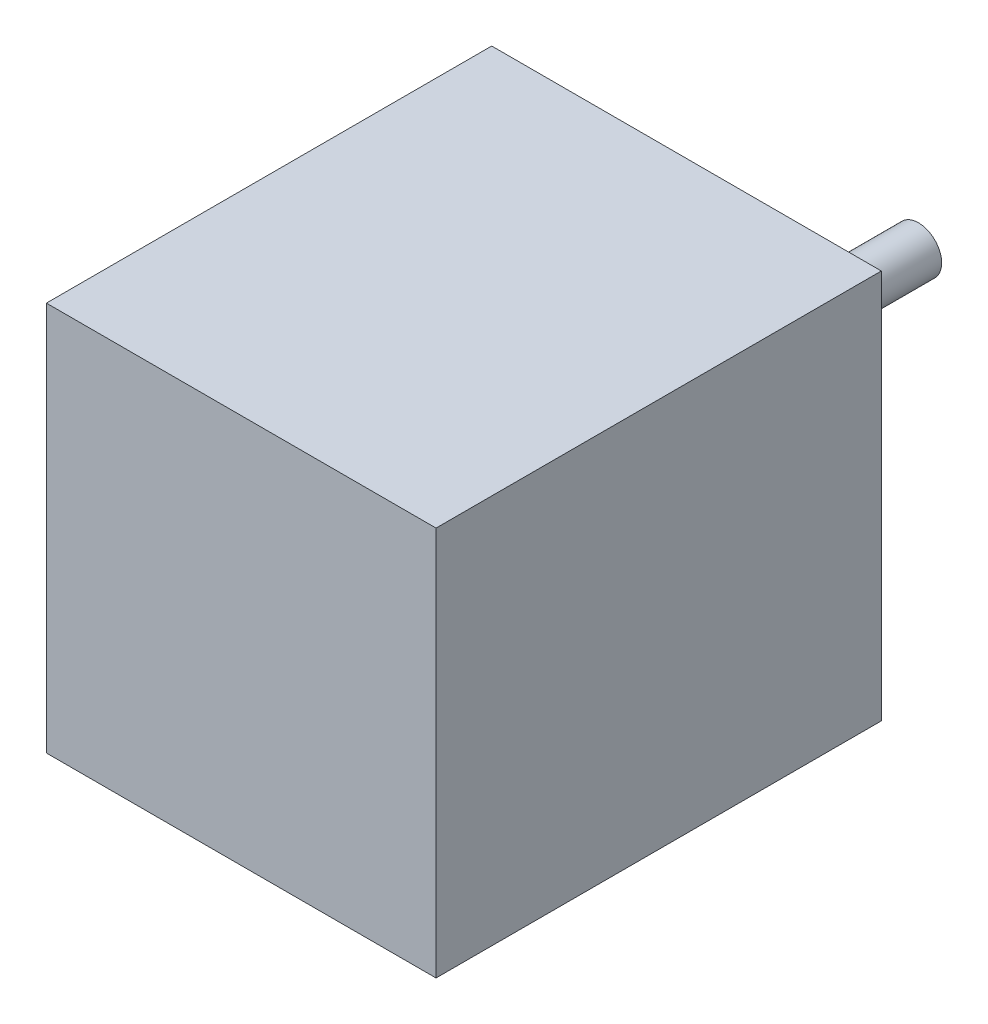
ISO-10303-21;
HEADER;
FILE_DESCRIPTION(('STEP AP214'),'2;1');
FILE_NAME('part.step','',(''),(''),'','','');
FILE_SCHEMA(('AUTOMOTIVE_DESIGN { 1 0 10303 214 1 1 1 1 }'));
ENDSEC;
DATA;
#1=APPLICATION_CONTEXT('core data for automotive mechanical design processes');
#2=APPLICATION_PROTOCOL_DEFINITION('international standard','automotive_design',2000,#1);
#3=PRODUCT_CONTEXT('',#1,'mechanical');
#4=PRODUCT('Part','Part','',(#3));
#5=PRODUCT_RELATED_PRODUCT_CATEGORY('part','',(#4));
#6=PRODUCT_DEFINITION_FORMATION('','',#4);
#7=PRODUCT_DEFINITION_CONTEXT('part definition',#1,'design');
#8=PRODUCT_DEFINITION('design','',#6,#7);
#9=PRODUCT_DEFINITION_SHAPE('','',#8);
#10=(LENGTH_UNIT() NAMED_UNIT(*) SI_UNIT(.MILLI.,.METRE.));
#11=(NAMED_UNIT(*) PLANE_ANGLE_UNIT() SI_UNIT($,.RADIAN.));
#12=(NAMED_UNIT(*) SI_UNIT($,.STERADIAN.) SOLID_ANGLE_UNIT());
#13=UNCERTAINTY_MEASURE_WITH_UNIT(LENGTH_MEASURE(1.E-05),#10,'distance_accuracy_value','');
#14=(GEOMETRIC_REPRESENTATION_CONTEXT(3) GLOBAL_UNCERTAINTY_ASSIGNED_CONTEXT((#13)) GLOBAL_UNIT_ASSIGNED_CONTEXT((#10,
#11,#12)) REPRESENTATION_CONTEXT('',''));
#15=CARTESIAN_POINT('',(0.,0.,0.));
#16=DIRECTION('',(0.,0.,1.));
#17=DIRECTION('',(1.,0.,0.));
#18=AXIS2_PLACEMENT_3D('',#15,#16,#17);
#19=CARTESIAN_POINT('',(0.,0.,48.));
#20=DIRECTION('',(-1.,0.,0.));
#21=DIRECTION('',(0.,0.,1.));
#22=AXIS2_PLACEMENT_3D('',#19,#20,#21);
#23=PLANE('',#22);
#24=DIRECTION('',(0.,1.,0.));
#25=VECTOR('',#24,1.);
#26=CARTESIAN_POINT('',(0.,0.,0.));
#27=LINE('',#26,#25);
#28=CARTESIAN_POINT('',(0.,0.,0.));
#29=VERTEX_POINT('',#28);
#30=CARTESIAN_POINT('',(0.,42.,0.));
#31=VERTEX_POINT('',#30);
#32=EDGE_CURVE('E113',#29,#31,#27,.T.);
#33=ORIENTED_EDGE('',*,*,#32,.T.);
#34=DIRECTION('',(0.,0.,-1.));
#35=VECTOR('',#34,1.);
#36=CARTESIAN_POINT('',(0.,42.,48.));
#37=LINE('',#36,#35);
#38=CARTESIAN_POINT('',(0.,42.,48.));
#39=VERTEX_POINT('',#38);
#40=EDGE_CURVE('E44',#39,#31,#37,.T.);
#41=ORIENTED_EDGE('',*,*,#40,.F.);
#42=DIRECTION('',(0.,1.,0.));
#43=VECTOR('',#42,1.);
#44=CARTESIAN_POINT('',(0.,0.,48.));
#45=LINE('',#44,#43);
#46=CARTESIAN_POINT('',(0.,0.,48.));
#47=VERTEX_POINT('',#46);
#48=EDGE_CURVE('E96',#47,#39,#45,.T.);
#49=ORIENTED_EDGE('',*,*,#48,.F.);
#50=DIRECTION('',(0.,0.,-1.));
#51=VECTOR('',#50,1.);
#52=CARTESIAN_POINT('',(0.,0.,48.));
#53=LINE('',#52,#51);
#54=EDGE_CURVE('E109',#47,#29,#53,.T.);
#55=ORIENTED_EDGE('',*,*,#54,.T.);
#56=EDGE_LOOP('',(#33,#41,#49,#55));
#57=FACE_BOUND('',#56,.T.);
#58=ADVANCED_FACE('F41',(#57),#23,.F.);
#59=CARTESIAN_POINT('',(0.,42.,48.));
#60=DIRECTION('',(0.,-1.,0.));
#61=DIRECTION('',(1.,0.,0.));
#62=AXIS2_PLACEMENT_3D('',#59,#60,#61);
#63=PLANE('',#62);
#64=DIRECTION('',(-1.,0.,0.));
#65=VECTOR('',#64,1.);
#66=CARTESIAN_POINT('',(0.,42.,0.));
#67=LINE('',#66,#65);
#68=CARTESIAN_POINT('',(-42.,42.,0.));
#69=VERTEX_POINT('',#68);
#70=EDGE_CURVE('E102',#31,#69,#67,.T.);
#71=ORIENTED_EDGE('',*,*,#70,.T.);
#72=DIRECTION('',(0.,0.,-1.));
#73=VECTOR('',#72,1.);
#74=CARTESIAN_POINT('',(-42.,42.,48.));
#75=LINE('',#74,#73);
#76=CARTESIAN_POINT('',(-42.,42.,48.));
#77=VERTEX_POINT('',#76);
#78=EDGE_CURVE('E100',#77,#69,#75,.T.);
#79=ORIENTED_EDGE('',*,*,#78,.F.);
#80=DIRECTION('',(-1.,0.,0.));
#81=VECTOR('',#80,1.);
#82=CARTESIAN_POINT('',(0.,42.,48.));
#83=LINE('',#82,#81);
#84=EDGE_CURVE('E91',#39,#77,#83,.T.);
#85=ORIENTED_EDGE('',*,*,#84,.F.);
#86=ORIENTED_EDGE('',*,*,#40,.T.);
#87=EDGE_LOOP('',(#71,#79,#85,#86));
#88=FACE_BOUND('',#87,.T.);
#89=ADVANCED_FACE('F101',(#88),#63,.F.);
#90=CARTESIAN_POINT('',(-42.,0.,48.));
#91=DIRECTION('',(1.,0.,0.));
#92=DIRECTION('',(0.,0.,-1.));
#93=AXIS2_PLACEMENT_3D('',#90,#91,#92);
#94=PLANE('',#93);
#95=DIRECTION('',(0.,-1.,0.));
#96=VECTOR('',#95,1.);
#97=CARTESIAN_POINT('',(-42.,0.,0.));
#98=LINE('',#97,#96);
#99=CARTESIAN_POINT('',(-42.,0.,0.));
#100=VERTEX_POINT('',#99);
#101=EDGE_CURVE('E77',#69,#100,#98,.T.);
#102=ORIENTED_EDGE('',*,*,#101,.T.);
#103=DIRECTION('',(0.,0.,-1.));
#104=VECTOR('',#103,1.);
#105=CARTESIAN_POINT('',(-42.,0.,48.));
#106=LINE('',#105,#104);
#107=CARTESIAN_POINT('',(-42.,0.,48.));
#108=VERTEX_POINT('',#107);
#109=EDGE_CURVE('E104',#108,#100,#106,.T.);
#110=ORIENTED_EDGE('',*,*,#109,.F.);
#111=DIRECTION('',(0.,-1.,0.));
#112=VECTOR('',#111,1.);
#113=CARTESIAN_POINT('',(-42.,0.,48.));
#114=LINE('',#113,#112);
#115=EDGE_CURVE('E94',#77,#108,#114,.T.);
#116=ORIENTED_EDGE('',*,*,#115,.F.);
#117=ORIENTED_EDGE('',*,*,#78,.T.);
#118=EDGE_LOOP('',(#102,#110,#116,#117));
#119=FACE_BOUND('',#118,.T.);
#120=ADVANCED_FACE('F105',(#119),#94,.F.);
#121=CARTESIAN_POINT('',(0.,0.,48.));
#122=DIRECTION('',(0.,1.,0.));
#123=DIRECTION('',(-1.,0.,0.));
#124=AXIS2_PLACEMENT_3D('',#121,#122,#123);
#125=PLANE('',#124);
#126=DIRECTION('',(1.,0.,0.));
#127=VECTOR('',#126,1.);
#128=CARTESIAN_POINT('',(0.,0.,0.));
#129=LINE('',#128,#127);
#130=EDGE_CURVE('E83',#100,#29,#129,.T.);
#131=ORIENTED_EDGE('',*,*,#130,.T.);
#132=ORIENTED_EDGE('',*,*,#54,.F.);
#133=DIRECTION('',(1.,0.,0.));
#134=VECTOR('',#133,1.);
#135=CARTESIAN_POINT('',(0.,0.,48.));
#136=LINE('',#135,#134);
#137=EDGE_CURVE('E60',#108,#47,#136,.T.);
#138=ORIENTED_EDGE('',*,*,#137,.F.);
#139=ORIENTED_EDGE('',*,*,#109,.T.);
#140=EDGE_LOOP('',(#131,#132,#138,#139));
#141=FACE_BOUND('',#140,.T.);
#142=ADVANCED_FACE('F127',(#141),#125,.F.);
#143=CARTESIAN_POINT('',(0.,0.,48.));
#144=DIRECTION('',(0.,0.,1.));
#145=DIRECTION('',(1.,0.,0.));
#146=AXIS2_PLACEMENT_3D('',#143,#144,#145);
#147=PLANE('',#146);
#148=ORIENTED_EDGE('',*,*,#48,.T.);
#149=ORIENTED_EDGE('',*,*,#84,.T.);
#150=ORIENTED_EDGE('',*,*,#115,.T.);
#151=ORIENTED_EDGE('',*,*,#137,.T.);
#152=EDGE_LOOP('',(#148,#149,#150,#151));
#153=FACE_BOUND('',#152,.T.);
#154=ADVANCED_FACE('F92',(#153),#147,.T.);
#155=CARTESIAN_POINT('',(0.,0.,0.));
#156=DIRECTION('',(0.,0.,1.));
#157=DIRECTION('',(1.,0.,0.));
#158=AXIS2_PLACEMENT_3D('',#155,#156,#157);
#159=PLANE('',#158);
#160=CARTESIAN_POINT('',(-5.5,36.5,0.));
#161=DIRECTION('',(0.,0.,-1.));
#162=DIRECTION('',(-1.,0.,0.));
#163=AXIS2_PLACEMENT_3D('',#160,#161,#162);
#164=CIRCLE('',#163,1.5);
#165=CARTESIAN_POINT('',(-7.,36.5,0.));
#166=VERTEX_POINT('',#165);
#167=EDGE_CURVE('E153',#166,#166,#164,.T.);
#168=ORIENTED_EDGE('',*,*,#167,.F.);
#169=EDGE_LOOP('',(#168));
#170=FACE_BOUND('',#169,.T.);
#171=CARTESIAN_POINT('',(-36.5,36.5,0.));
#172=DIRECTION('',(0.,0.,-1.));
#173=DIRECTION('',(-1.,0.,0.));
#174=AXIS2_PLACEMENT_3D('',#171,#172,#173);
#175=CIRCLE('',#174,1.5);
#176=CARTESIAN_POINT('',(-38.,36.5,0.));
#177=VERTEX_POINT('',#176);
#178=EDGE_CURVE('E161',#177,#177,#175,.T.);
#179=ORIENTED_EDGE('',*,*,#178,.F.);
#180=EDGE_LOOP('',(#179));
#181=FACE_BOUND('',#180,.T.);
#182=CARTESIAN_POINT('',(-36.5,5.5,0.));
#183=DIRECTION('',(0.,0.,-1.));
#184=DIRECTION('',(-1.,0.,0.));
#185=AXIS2_PLACEMENT_3D('',#182,#183,#184);
#186=CIRCLE('',#185,1.5);
#187=CARTESIAN_POINT('',(-38.,5.5,0.));
#188=VERTEX_POINT('',#187);
#189=EDGE_CURVE('E169',#188,#188,#186,.T.);
#190=ORIENTED_EDGE('',*,*,#189,.F.);
#191=EDGE_LOOP('',(#190));
#192=FACE_BOUND('',#191,.T.);
#193=CARTESIAN_POINT('',(-5.5,5.5,0.));
#194=DIRECTION('',(0.,0.,-1.));
#195=DIRECTION('',(-1.,0.,0.));
#196=AXIS2_PLACEMENT_3D('',#193,#194,#195);
#197=CIRCLE('',#196,1.5);
#198=CARTESIAN_POINT('',(-7.,5.5,0.));
#199=VERTEX_POINT('',#198);
#200=EDGE_CURVE('E145',#199,#199,#197,.T.);
#201=ORIENTED_EDGE('',*,*,#200,.F.);
#202=EDGE_LOOP('',(#201));
#203=FACE_BOUND('',#202,.T.);
#204=CARTESIAN_POINT('',(-21.,21.,0.));
#205=DIRECTION('',(0.,0.,-1.));
#206=DIRECTION('',(-1.,0.,0.));
#207=AXIS2_PLACEMENT_3D('',#204,#205,#206);
#208=CIRCLE('',#207,11.);
#209=CARTESIAN_POINT('',(-32.,21.,0.));
#210=VERTEX_POINT('',#209);
#211=EDGE_CURVE('E51',#210,#210,#208,.T.);
#212=ORIENTED_EDGE('',*,*,#211,.F.);
#213=EDGE_LOOP('',(#212));
#214=FACE_BOUND('',#213,.T.);
#215=ORIENTED_EDGE('',*,*,#32,.F.);
#216=ORIENTED_EDGE('',*,*,#130,.F.);
#217=ORIENTED_EDGE('',*,*,#101,.F.);
#218=ORIENTED_EDGE('',*,*,#70,.F.);
#219=EDGE_LOOP('',(#215,#216,#217,#218));
#220=FACE_BOUND('',#219,.T.);
#221=ADVANCED_FACE('F130',(#170,#181,#192,#203,#214,#220),#159,.F.);
#222=CARTESIAN_POINT('',(-21.,21.,-2.));
#223=DIRECTION('',(0.,0.,1.));
#224=DIRECTION('',(1.,0.,0.));
#225=AXIS2_PLACEMENT_3D('',#222,#223,#224);
#226=CYLINDRICAL_SURFACE('',#225,11.);
#227=CARTESIAN_POINT('',(-21.,21.,-2.));
#228=DIRECTION('',(0.,0.,-1.));
#229=DIRECTION('',(-1.,0.,0.));
#230=AXIS2_PLACEMENT_3D('',#227,#228,#229);
#231=CIRCLE('',#230,11.);
#232=CARTESIAN_POINT('',(-32.,21.,-2.));
#233=VERTEX_POINT('',#232);
#234=EDGE_CURVE('E117',#233,#233,#231,.T.);
#235=ORIENTED_EDGE('',*,*,#234,.F.);
#236=EDGE_LOOP('',(#235));
#237=FACE_BOUND('',#236,.T.);
#238=ORIENTED_EDGE('',*,*,#211,.T.);
#239=EDGE_LOOP('',(#238));
#240=FACE_BOUND('',#239,.T.);
#241=ADVANCED_FACE('F188',(#237,#240),#226,.T.);
#242=CARTESIAN_POINT('',(-21.,21.,-2.));
#243=DIRECTION('',(0.,0.,-1.));
#244=DIRECTION('',(-1.,0.,0.));
#245=AXIS2_PLACEMENT_3D('',#242,#243,#244);
#246=PLANE('',#245);
#247=CARTESIAN_POINT('',(-21.,21.,-2.));
#248=DIRECTION('',(0.,0.,-1.));
#249=DIRECTION('',(-1.,0.,0.));
#250=AXIS2_PLACEMENT_3D('',#247,#248,#249);
#251=CIRCLE('',#250,2.5);
#252=CARTESIAN_POINT('',(-23.5,21.,-2.));
#253=VERTEX_POINT('',#252);
#254=EDGE_CURVE('E11',#253,#253,#251,.T.);
#255=ORIENTED_EDGE('',*,*,#254,.F.);
#256=EDGE_LOOP('',(#255));
#257=FACE_BOUND('',#256,.T.);
#258=ORIENTED_EDGE('',*,*,#234,.T.);
#259=EDGE_LOOP('',(#258));
#260=FACE_BOUND('',#259,.T.);
#261=ADVANCED_FACE('F196',(#257,#260),#246,.T.);
#262=CARTESIAN_POINT('',(-21.,21.,-25.));
#263=DIRECTION('',(0.,0.,1.));
#264=DIRECTION('',(1.,0.,0.));
#265=AXIS2_PLACEMENT_3D('',#262,#263,#264);
#266=CYLINDRICAL_SURFACE('',#265,2.5);
#267=CARTESIAN_POINT('',(-21.,21.,-25.));
#268=DIRECTION('',(0.,0.,-1.));
#269=DIRECTION('',(-1.,0.,0.));
#270=AXIS2_PLACEMENT_3D('',#267,#268,#269);
#271=CIRCLE('',#270,2.5);
#272=CARTESIAN_POINT('',(-23.5,21.,-25.));
#273=VERTEX_POINT('',#272);
#274=EDGE_CURVE('E139',#273,#273,#271,.T.);
#275=ORIENTED_EDGE('',*,*,#274,.F.);
#276=EDGE_LOOP('',(#275));
#277=FACE_BOUND('',#276,.T.);
#278=ORIENTED_EDGE('',*,*,#254,.T.);
#279=EDGE_LOOP('',(#278));
#280=FACE_BOUND('',#279,.T.);
#281=ADVANCED_FACE('F202',(#277,#280),#266,.T.);
#282=CARTESIAN_POINT('',(-21.,21.,-25.));
#283=DIRECTION('',(0.,0.,-1.));
#284=DIRECTION('',(-1.,0.,0.));
#285=AXIS2_PLACEMENT_3D('',#282,#283,#284);
#286=PLANE('',#285);
#287=ORIENTED_EDGE('',*,*,#274,.T.);
#288=EDGE_LOOP('',(#287));
#289=FACE_BOUND('',#288,.T.);
#290=ADVANCED_FACE('F233',(#289),#286,.T.);
#291=CARTESIAN_POINT('',(-5.5,5.5,8.));
#292=DIRECTION('',(0.,0.,-1.));
#293=DIRECTION('',(-1.,0.,0.));
#294=AXIS2_PLACEMENT_3D('',#291,#292,#293);
#295=CYLINDRICAL_SURFACE('',#294,1.5);
#296=CARTESIAN_POINT('',(-5.5,5.5,8.));
#297=DIRECTION('',(0.,0.,-1.));
#298=DIRECTION('',(-1.,0.,0.));
#299=AXIS2_PLACEMENT_3D('',#296,#297,#298);
#300=CIRCLE('',#299,1.5);
#301=CARTESIAN_POINT('',(-7.,5.5,8.));
#302=VERTEX_POINT('',#301);
#303=EDGE_CURVE('E144',#302,#302,#300,.T.);
#304=ORIENTED_EDGE('',*,*,#303,.F.);
#305=EDGE_LOOP('',(#304));
#306=FACE_BOUND('',#305,.T.);
#307=ORIENTED_EDGE('',*,*,#200,.T.);
#308=EDGE_LOOP('',(#307));
#309=FACE_BOUND('',#308,.T.);
#310=ADVANCED_FACE('F238',(#306,#309),#295,.F.);
#311=CARTESIAN_POINT('',(-5.5,5.5,8.));
#312=DIRECTION('',(0.,0.,-1.));
#313=DIRECTION('',(-1.,0.,0.));
#314=AXIS2_PLACEMENT_3D('',#311,#312,#313);
#315=PLANE('',#314);
#316=ORIENTED_EDGE('',*,*,#303,.T.);
#317=EDGE_LOOP('',(#316));
#318=FACE_BOUND('',#317,.T.);
#319=ADVANCED_FACE('F182',(#318),#315,.T.);
#320=CARTESIAN_POINT('',(-36.5,5.5,8.));
#321=DIRECTION('',(0.,0.,-1.));
#322=DIRECTION('',(-1.,0.,0.));
#323=AXIS2_PLACEMENT_3D('',#320,#321,#322);
#324=CYLINDRICAL_SURFACE('',#323,1.5);
#325=CARTESIAN_POINT('',(-36.5,5.5,8.));
#326=DIRECTION('',(0.,0.,-1.));
#327=DIRECTION('',(-1.,0.,0.));
#328=AXIS2_PLACEMENT_3D('',#325,#326,#327);
#329=CIRCLE('',#328,1.5);
#330=CARTESIAN_POINT('',(-38.,5.5,8.));
#331=VERTEX_POINT('',#330);
#332=EDGE_CURVE('E149',#331,#331,#329,.T.);
#333=ORIENTED_EDGE('',*,*,#332,.F.);
#334=EDGE_LOOP('',(#333));
#335=FACE_BOUND('',#334,.T.);
#336=ORIENTED_EDGE('',*,*,#189,.T.);
#337=EDGE_LOOP('',(#336));
#338=FACE_BOUND('',#337,.T.);
#339=ADVANCED_FACE('F179',(#335,#338),#324,.F.);
#340=CARTESIAN_POINT('',(-36.5,5.5,8.));
#341=DIRECTION('',(0.,0.,-1.));
#342=DIRECTION('',(-1.,0.,0.));
#343=AXIS2_PLACEMENT_3D('',#340,#341,#342);
#344=PLANE('',#343);
#345=ORIENTED_EDGE('',*,*,#332,.T.);
#346=EDGE_LOOP('',(#345));
#347=FACE_BOUND('',#346,.T.);
#348=ADVANCED_FACE('F177',(#347),#344,.T.);
#349=CARTESIAN_POINT('',(-36.5,36.5,8.));
#350=DIRECTION('',(0.,0.,-1.));
#351=DIRECTION('',(-1.,0.,0.));
#352=AXIS2_PLACEMENT_3D('',#349,#350,#351);
#353=CYLINDRICAL_SURFACE('',#352,1.5);
#354=CARTESIAN_POINT('',(-36.5,36.5,8.));
#355=DIRECTION('',(0.,0.,-1.));
#356=DIRECTION('',(-1.,0.,0.));
#357=AXIS2_PLACEMENT_3D('',#354,#355,#356);
#358=CIRCLE('',#357,1.5);
#359=CARTESIAN_POINT('',(-38.,36.5,8.));
#360=VERTEX_POINT('',#359);
#361=EDGE_CURVE('E165',#360,#360,#358,.T.);
#362=ORIENTED_EDGE('',*,*,#361,.F.);
#363=EDGE_LOOP('',(#362));
#364=FACE_BOUND('',#363,.T.);
#365=ORIENTED_EDGE('',*,*,#178,.T.);
#366=EDGE_LOOP('',(#365));
#367=FACE_BOUND('',#366,.T.);
#368=ADVANCED_FACE('F267',(#364,#367),#353,.F.);
#369=CARTESIAN_POINT('',(-36.5,36.5,8.));
#370=DIRECTION('',(0.,0.,-1.));
#371=DIRECTION('',(-1.,0.,0.));
#372=AXIS2_PLACEMENT_3D('',#369,#370,#371);
#373=PLANE('',#372);
#374=ORIENTED_EDGE('',*,*,#361,.T.);
#375=EDGE_LOOP('',(#374));
#376=FACE_BOUND('',#375,.T.);
#377=ADVANCED_FACE('F276',(#376),#373,.T.);
#378=CARTESIAN_POINT('',(-5.5,36.5,8.));
#379=DIRECTION('',(0.,0.,-1.));
#380=DIRECTION('',(-1.,0.,0.));
#381=AXIS2_PLACEMENT_3D('',#378,#379,#380);
#382=CYLINDRICAL_SURFACE('',#381,1.5);
#383=CARTESIAN_POINT('',(-5.5,36.5,8.));
#384=DIRECTION('',(0.,0.,-1.));
#385=DIRECTION('',(-1.,0.,0.));
#386=AXIS2_PLACEMENT_3D('',#383,#384,#385);
#387=CIRCLE('',#386,1.5);
#388=CARTESIAN_POINT('',(-7.,36.5,8.));
#389=VERTEX_POINT('',#388);
#390=EDGE_CURVE('E157',#389,#389,#387,.T.);
#391=ORIENTED_EDGE('',*,*,#390,.F.);
#392=EDGE_LOOP('',(#391));
#393=FACE_BOUND('',#392,.T.);
#394=ORIENTED_EDGE('',*,*,#167,.T.);
#395=EDGE_LOOP('',(#394));
#396=FACE_BOUND('',#395,.T.);
#397=ADVANCED_FACE('F286',(#393,#396),#382,.F.);
#398=CARTESIAN_POINT('',(-5.5,36.5,8.));
#399=DIRECTION('',(0.,0.,-1.));
#400=DIRECTION('',(-1.,0.,0.));
#401=AXIS2_PLACEMENT_3D('',#398,#399,#400);
#402=PLANE('',#401);
#403=ORIENTED_EDGE('',*,*,#390,.T.);
#404=EDGE_LOOP('',(#403));
#405=FACE_BOUND('',#404,.T.);
#406=ADVANCED_FACE('F296',(#405),#402,.T.);
#407=CLOSED_SHELL('',(#58,#89,#120,#142,#154,#221,#241,#261,#281,#290,#310,#319,#339,#348,#368,
#377,#397,#406));
#408=MANIFOLD_SOLID_BREP('B2',#407);
#409=ADVANCED_BREP_SHAPE_REPRESENTATION('',(#18,#408),#14);
#410=SHAPE_DEFINITION_REPRESENTATION(#9,#409);
ENDSEC;
END-ISO-10303-21;
